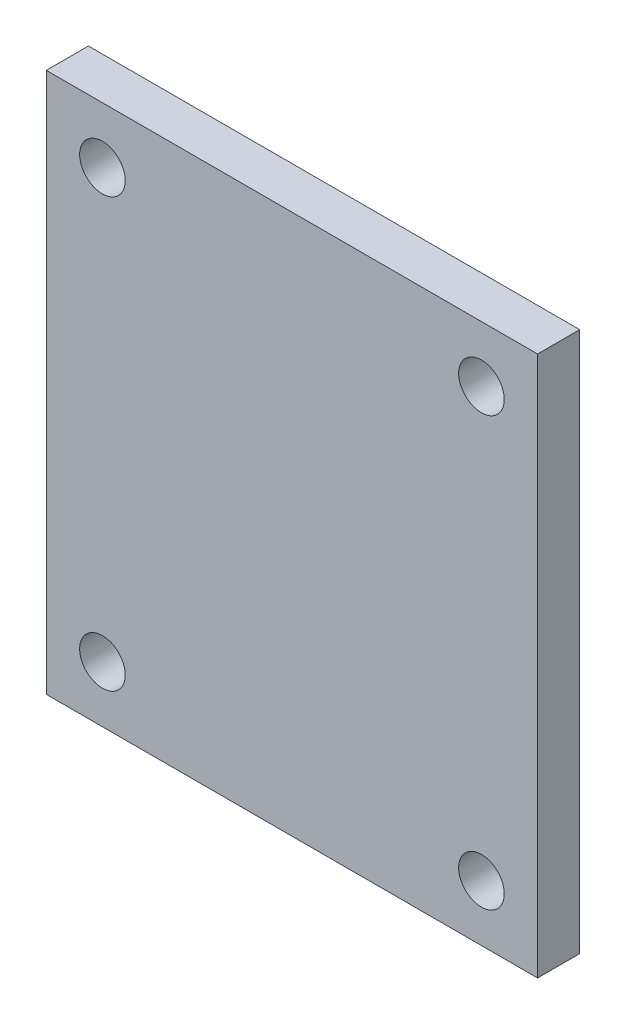
ISO-10303-21;
HEADER;
FILE_DESCRIPTION(('STEP AP214'),'2;1');
FILE_NAME('part.step','',(''),(''),'','','');
FILE_SCHEMA(('AUTOMOTIVE_DESIGN { 1 0 10303 214 1 1 1 1 }'));
ENDSEC;
DATA;
#1=APPLICATION_CONTEXT('core data for automotive mechanical design processes');
#2=APPLICATION_PROTOCOL_DEFINITION('international standard','automotive_design',2000,#1);
#3=PRODUCT_CONTEXT('',#1,'mechanical');
#4=PRODUCT('Part','Part','',(#3));
#5=PRODUCT_RELATED_PRODUCT_CATEGORY('part','',(#4));
#6=PRODUCT_DEFINITION_FORMATION('','',#4);
#7=PRODUCT_DEFINITION_CONTEXT('part definition',#1,'design');
#8=PRODUCT_DEFINITION('design','',#6,#7);
#9=PRODUCT_DEFINITION_SHAPE('','',#8);
#10=(LENGTH_UNIT() NAMED_UNIT(*) SI_UNIT(.MILLI.,.METRE.));
#11=(NAMED_UNIT(*) PLANE_ANGLE_UNIT() SI_UNIT($,.RADIAN.));
#12=(NAMED_UNIT(*) SI_UNIT($,.STERADIAN.) SOLID_ANGLE_UNIT());
#13=UNCERTAINTY_MEASURE_WITH_UNIT(LENGTH_MEASURE(1.E-05),#10,'distance_accuracy_value','');
#14=(GEOMETRIC_REPRESENTATION_CONTEXT(3) GLOBAL_UNCERTAINTY_ASSIGNED_CONTEXT((#13)) GLOBAL_UNIT_ASSIGNED_CONTEXT((#10,
#11,#12)) REPRESENTATION_CONTEXT('',''));
#15=CARTESIAN_POINT('',(0.,0.,0.));
#16=DIRECTION('',(0.,0.,1.));
#17=DIRECTION('',(1.,0.,0.));
#18=AXIS2_PLACEMENT_3D('',#15,#16,#17);
#19=CARTESIAN_POINT('',(0.,0.,6.));
#20=DIRECTION('',(0.,0.,-1.));
#21=DIRECTION('',(-1.,0.,0.));
#22=AXIS2_PLACEMENT_3D('',#19,#20,#21);
#23=PLANE('',#22);
#24=CARTESIAN_POINT('',(-54.,-61.,6.));
#25=DIRECTION('',(0.,0.,1.));
#26=DIRECTION('',(-1.,0.,0.));
#27=AXIS2_PLACEMENT_3D('',#24,#25,#26);
#28=CIRCLE('',#27,6.50000000000002);
#29=CARTESIAN_POINT('',(-60.5,-61.,6.));
#30=VERTEX_POINT('',#29);
#31=EDGE_CURVE('E122',#30,#30,#28,.T.);
#32=ORIENTED_EDGE('',*,*,#31,.F.);
#33=EDGE_LOOP('',(#32));
#34=FACE_BOUND('',#33,.T.);
#35=CARTESIAN_POINT('',(-54.,61.,6.));
#36=DIRECTION('',(0.,0.,1.));
#37=DIRECTION('',(1.,0.,0.));
#38=AXIS2_PLACEMENT_3D('',#35,#36,#37);
#39=CIRCLE('',#38,6.50000000000002);
#40=CARTESIAN_POINT('',(-47.5,61.,6.));
#41=VERTEX_POINT('',#40);
#42=EDGE_CURVE('E101',#41,#41,#39,.T.);
#43=ORIENTED_EDGE('',*,*,#42,.F.);
#44=EDGE_LOOP('',(#43));
#45=FACE_BOUND('',#44,.T.);
#46=DIRECTION('',(0.,-1.,0.));
#47=VECTOR('',#46,1.);
#48=CARTESIAN_POINT('',(-70.,-77.,6.));
#49=LINE('',#48,#47);
#50=CARTESIAN_POINT('',(-70.,77.,6.));
#51=VERTEX_POINT('',#50);
#52=CARTESIAN_POINT('',(-70.,-77.,6.));
#53=VERTEX_POINT('',#52);
#54=EDGE_CURVE('E86',#51,#53,#49,.T.);
#55=ORIENTED_EDGE('',*,*,#54,.T.);
#56=DIRECTION('',(1.,0.,0.));
#57=VECTOR('',#56,1.);
#58=CARTESIAN_POINT('',(-70.,-77.,6.));
#59=LINE('',#58,#57);
#60=CARTESIAN_POINT('',(70.,-77.,6.));
#61=VERTEX_POINT('',#60);
#62=EDGE_CURVE('E81',#53,#61,#59,.T.);
#63=ORIENTED_EDGE('',*,*,#62,.T.);
#64=DIRECTION('',(0.,1.,0.));
#65=VECTOR('',#64,1.);
#66=CARTESIAN_POINT('',(70.,-77.,6.));
#67=LINE('',#66,#65);
#68=CARTESIAN_POINT('',(70.,77.,6.));
#69=VERTEX_POINT('',#68);
#70=EDGE_CURVE('E84',#61,#69,#67,.T.);
#71=ORIENTED_EDGE('',*,*,#70,.T.);
#72=DIRECTION('',(-1.,0.,0.));
#73=VECTOR('',#72,1.);
#74=CARTESIAN_POINT('',(-70.,77.,6.));
#75=LINE('',#74,#73);
#76=EDGE_CURVE('E51',#69,#51,#75,.T.);
#77=ORIENTED_EDGE('',*,*,#76,.T.);
#78=EDGE_LOOP('',(#55,#63,#71,#77));
#79=FACE_BOUND('',#78,.T.);
#80=CARTESIAN_POINT('',(54.,61.,6.));
#81=DIRECTION('',(0.,0.,1.));
#82=DIRECTION('',(-1.,0.,0.));
#83=AXIS2_PLACEMENT_3D('',#80,#81,#82);
#84=CIRCLE('',#83,6.50000000000001);
#85=CARTESIAN_POINT('',(47.5,61.,6.));
#86=VERTEX_POINT('',#85);
#87=EDGE_CURVE('E116',#86,#86,#84,.T.);
#88=ORIENTED_EDGE('',*,*,#87,.F.);
#89=EDGE_LOOP('',(#88));
#90=FACE_BOUND('',#89,.T.);
#91=CARTESIAN_POINT('',(54.,-61.,6.));
#92=DIRECTION('',(0.,0.,1.));
#93=DIRECTION('',(1.,0.,0.));
#94=AXIS2_PLACEMENT_3D('',#91,#92,#93);
#95=CIRCLE('',#94,6.50000000000001);
#96=CARTESIAN_POINT('',(60.5000000000001,-61.,6.));
#97=VERTEX_POINT('',#96);
#98=EDGE_CURVE('E128',#97,#97,#95,.T.);
#99=ORIENTED_EDGE('',*,*,#98,.F.);
#100=EDGE_LOOP('',(#99));
#101=FACE_BOUND('',#100,.T.);
#102=ADVANCED_FACE('F34',(#34,#45,#79,#90,#101),#23,.F.);
#103=CARTESIAN_POINT('',(0.,0.,-6.));
#104=DIRECTION('',(0.,0.,-1.));
#105=DIRECTION('',(-1.,0.,0.));
#106=AXIS2_PLACEMENT_3D('',#103,#104,#105);
#107=PLANE('',#106);
#108=CARTESIAN_POINT('',(-54.,-61.,-6.));
#109=DIRECTION('',(0.,0.,1.));
#110=DIRECTION('',(-1.,0.,0.));
#111=AXIS2_PLACEMENT_3D('',#108,#109,#110);
#112=CIRCLE('',#111,6.50000000000002);
#113=CARTESIAN_POINT('',(-60.5,-61.,-6.));
#114=VERTEX_POINT('',#113);
#115=EDGE_CURVE('E125',#114,#114,#112,.T.);
#116=ORIENTED_EDGE('',*,*,#115,.T.);
#117=EDGE_LOOP('',(#116));
#118=FACE_BOUND('',#117,.T.);
#119=CARTESIAN_POINT('',(-54.,61.,-6.));
#120=DIRECTION('',(0.,0.,1.));
#121=DIRECTION('',(1.,0.,0.));
#122=AXIS2_PLACEMENT_3D('',#119,#120,#121);
#123=CIRCLE('',#122,6.50000000000002);
#124=CARTESIAN_POINT('',(-47.5,61.,-6.));
#125=VERTEX_POINT('',#124);
#126=EDGE_CURVE('E113',#125,#125,#123,.T.);
#127=ORIENTED_EDGE('',*,*,#126,.T.);
#128=EDGE_LOOP('',(#127));
#129=FACE_BOUND('',#128,.T.);
#130=DIRECTION('',(0.,-1.,0.));
#131=VECTOR('',#130,1.);
#132=CARTESIAN_POINT('',(-70.,-77.,-6.));
#133=LINE('',#132,#131);
#134=CARTESIAN_POINT('',(-70.,77.,-6.));
#135=VERTEX_POINT('',#134);
#136=CARTESIAN_POINT('',(-70.,-77.,-6.));
#137=VERTEX_POINT('',#136);
#138=EDGE_CURVE('E98',#135,#137,#133,.T.);
#139=ORIENTED_EDGE('',*,*,#138,.F.);
#140=DIRECTION('',(-1.,0.,0.));
#141=VECTOR('',#140,1.);
#142=CARTESIAN_POINT('',(-70.,77.,-6.));
#143=LINE('',#142,#141);
#144=CARTESIAN_POINT('',(70.,77.,-6.));
#145=VERTEX_POINT('',#144);
#146=EDGE_CURVE('E74',#145,#135,#143,.T.);
#147=ORIENTED_EDGE('',*,*,#146,.F.);
#148=DIRECTION('',(0.,1.,0.));
#149=VECTOR('',#148,1.);
#150=CARTESIAN_POINT('',(70.,-77.,-6.));
#151=LINE('',#150,#149);
#152=CARTESIAN_POINT('',(70.,-77.,-6.));
#153=VERTEX_POINT('',#152);
#154=EDGE_CURVE('E68',#153,#145,#151,.T.);
#155=ORIENTED_EDGE('',*,*,#154,.F.);
#156=DIRECTION('',(1.,0.,0.));
#157=VECTOR('',#156,1.);
#158=CARTESIAN_POINT('',(-70.,-77.,-6.));
#159=LINE('',#158,#157);
#160=EDGE_CURVE('E90',#137,#153,#159,.T.);
#161=ORIENTED_EDGE('',*,*,#160,.F.);
#162=EDGE_LOOP('',(#139,#147,#155,#161));
#163=FACE_BOUND('',#162,.T.);
#164=CARTESIAN_POINT('',(54.,61.,-6.));
#165=DIRECTION('',(0.,0.,1.));
#166=DIRECTION('',(-1.,0.,0.));
#167=AXIS2_PLACEMENT_3D('',#164,#165,#166);
#168=CIRCLE('',#167,6.50000000000001);
#169=CARTESIAN_POINT('',(47.5,61.,-6.));
#170=VERTEX_POINT('',#169);
#171=EDGE_CURVE('E119',#170,#170,#168,.T.);
#172=ORIENTED_EDGE('',*,*,#171,.T.);
#173=EDGE_LOOP('',(#172));
#174=FACE_BOUND('',#173,.T.);
#175=CARTESIAN_POINT('',(54.,-61.,-6.));
#176=DIRECTION('',(0.,0.,1.));
#177=DIRECTION('',(1.,0.,0.));
#178=AXIS2_PLACEMENT_3D('',#175,#176,#177);
#179=CIRCLE('',#178,6.50000000000001);
#180=CARTESIAN_POINT('',(60.5000000000001,-61.,-6.));
#181=VERTEX_POINT('',#180);
#182=EDGE_CURVE('E131',#181,#181,#179,.T.);
#183=ORIENTED_EDGE('',*,*,#182,.T.);
#184=EDGE_LOOP('',(#183));
#185=FACE_BOUND('',#184,.T.);
#186=ADVANCED_FACE('F109',(#118,#129,#163,#174,#185),#107,.T.);
#187=CARTESIAN_POINT('',(-70.,-77.,6.));
#188=DIRECTION('',(1.,0.,0.));
#189=DIRECTION('',(0.,0.,-1.));
#190=AXIS2_PLACEMENT_3D('',#187,#188,#189);
#191=PLANE('',#190);
#192=ORIENTED_EDGE('',*,*,#138,.T.);
#193=DIRECTION('',(0.,0.,-1.));
#194=VECTOR('',#193,1.);
#195=CARTESIAN_POINT('',(-70.,-77.,6.));
#196=LINE('',#195,#194);
#197=EDGE_CURVE('E11',#53,#137,#196,.T.);
#198=ORIENTED_EDGE('',*,*,#197,.F.);
#199=ORIENTED_EDGE('',*,*,#54,.F.);
#200=DIRECTION('',(0.,0.,-1.));
#201=VECTOR('',#200,1.);
#202=CARTESIAN_POINT('',(-70.,77.,6.));
#203=LINE('',#202,#201);
#204=EDGE_CURVE('E94',#51,#135,#203,.T.);
#205=ORIENTED_EDGE('',*,*,#204,.T.);
#206=EDGE_LOOP('',(#192,#198,#199,#205));
#207=FACE_BOUND('',#206,.T.);
#208=ADVANCED_FACE('F36',(#207),#191,.F.);
#209=CARTESIAN_POINT('',(-70.,-77.,6.));
#210=DIRECTION('',(0.,1.,0.));
#211=DIRECTION('',(0.,0.,1.));
#212=AXIS2_PLACEMENT_3D('',#209,#210,#211);
#213=PLANE('',#212);
#214=ORIENTED_EDGE('',*,*,#160,.T.);
#215=DIRECTION('',(0.,0.,-1.));
#216=VECTOR('',#215,1.);
#217=CARTESIAN_POINT('',(70.,-77.,6.));
#218=LINE('',#217,#216);
#219=EDGE_CURVE('E43',#61,#153,#218,.T.);
#220=ORIENTED_EDGE('',*,*,#219,.F.);
#221=ORIENTED_EDGE('',*,*,#62,.F.);
#222=ORIENTED_EDGE('',*,*,#197,.T.);
#223=EDGE_LOOP('',(#214,#220,#221,#222));
#224=FACE_BOUND('',#223,.T.);
#225=ADVANCED_FACE('F89',(#224),#213,.F.);
#226=CARTESIAN_POINT('',(70.,-77.,6.));
#227=DIRECTION('',(-1.,0.,0.));
#228=DIRECTION('',(0.,0.,1.));
#229=AXIS2_PLACEMENT_3D('',#226,#227,#228);
#230=PLANE('',#229);
#231=ORIENTED_EDGE('',*,*,#154,.T.);
#232=DIRECTION('',(0.,0.,-1.));
#233=VECTOR('',#232,1.);
#234=CARTESIAN_POINT('',(70.,77.,6.));
#235=LINE('',#234,#233);
#236=EDGE_CURVE('E91',#69,#145,#235,.T.);
#237=ORIENTED_EDGE('',*,*,#236,.F.);
#238=ORIENTED_EDGE('',*,*,#70,.F.);
#239=ORIENTED_EDGE('',*,*,#219,.T.);
#240=EDGE_LOOP('',(#231,#237,#238,#239));
#241=FACE_BOUND('',#240,.T.);
#242=ADVANCED_FACE('F92',(#241),#230,.F.);
#243=CARTESIAN_POINT('',(-70.,77.,6.));
#244=DIRECTION('',(0.,-1.,0.));
#245=DIRECTION('',(0.,0.,-1.));
#246=AXIS2_PLACEMENT_3D('',#243,#244,#245);
#247=PLANE('',#246);
#248=ORIENTED_EDGE('',*,*,#146,.T.);
#249=ORIENTED_EDGE('',*,*,#204,.F.);
#250=ORIENTED_EDGE('',*,*,#76,.F.);
#251=ORIENTED_EDGE('',*,*,#236,.T.);
#252=EDGE_LOOP('',(#248,#249,#250,#251));
#253=FACE_BOUND('',#252,.T.);
#254=ADVANCED_FACE('F106',(#253),#247,.F.);
#255=CARTESIAN_POINT('',(-54.,61.,6.));
#256=DIRECTION('',(0.,0.,-1.));
#257=DIRECTION('',(-1.,0.,0.));
#258=AXIS2_PLACEMENT_3D('',#255,#256,#257);
#259=CYLINDRICAL_SURFACE('',#258,6.50000000000002);
#260=ORIENTED_EDGE('',*,*,#42,.T.);
#261=EDGE_LOOP('',(#260));
#262=FACE_BOUND('',#261,.T.);
#263=ORIENTED_EDGE('',*,*,#126,.F.);
#264=EDGE_LOOP('',(#263));
#265=FACE_BOUND('',#264,.T.);
#266=ADVANCED_FACE('F151',(#262,#265),#259,.F.);
#267=CARTESIAN_POINT('',(54.,61.,6.));
#268=DIRECTION('',(0.,0.,-1.));
#269=DIRECTION('',(-1.,0.,0.));
#270=AXIS2_PLACEMENT_3D('',#267,#268,#269);
#271=CYLINDRICAL_SURFACE('',#270,6.50000000000001);
#272=ORIENTED_EDGE('',*,*,#87,.T.);
#273=EDGE_LOOP('',(#272));
#274=FACE_BOUND('',#273,.T.);
#275=ORIENTED_EDGE('',*,*,#171,.F.);
#276=EDGE_LOOP('',(#275));
#277=FACE_BOUND('',#276,.T.);
#278=ADVANCED_FACE('F197',(#274,#277),#271,.F.);
#279=CARTESIAN_POINT('',(-54.,-61.,6.));
#280=DIRECTION('',(0.,0.,-1.));
#281=DIRECTION('',(-1.,0.,0.));
#282=AXIS2_PLACEMENT_3D('',#279,#280,#281);
#283=CYLINDRICAL_SURFACE('',#282,6.50000000000002);
#284=ORIENTED_EDGE('',*,*,#31,.T.);
#285=EDGE_LOOP('',(#284));
#286=FACE_BOUND('',#285,.T.);
#287=ORIENTED_EDGE('',*,*,#115,.F.);
#288=EDGE_LOOP('',(#287));
#289=FACE_BOUND('',#288,.T.);
#290=ADVANCED_FACE('F205',(#286,#289),#283,.F.);
#291=CARTESIAN_POINT('',(54.,-61.,6.));
#292=DIRECTION('',(0.,0.,-1.));
#293=DIRECTION('',(-1.,0.,0.));
#294=AXIS2_PLACEMENT_3D('',#291,#292,#293);
#295=CYLINDRICAL_SURFACE('',#294,6.50000000000001);
#296=ORIENTED_EDGE('',*,*,#98,.T.);
#297=EDGE_LOOP('',(#296));
#298=FACE_BOUND('',#297,.T.);
#299=ORIENTED_EDGE('',*,*,#182,.F.);
#300=EDGE_LOOP('',(#299));
#301=FACE_BOUND('',#300,.T.);
#302=ADVANCED_FACE('F137',(#298,#301),#295,.F.);
#303=CLOSED_SHELL('',(#102,#186,#208,#225,#242,#254,#266,#278,#290,#302));
#304=MANIFOLD_SOLID_BREP('B2',#303);
#305=ADVANCED_BREP_SHAPE_REPRESENTATION('',(#18,#304),#14);
#306=SHAPE_DEFINITION_REPRESENTATION(#9,#305);
ENDSEC;
END-ISO-10303-21;
